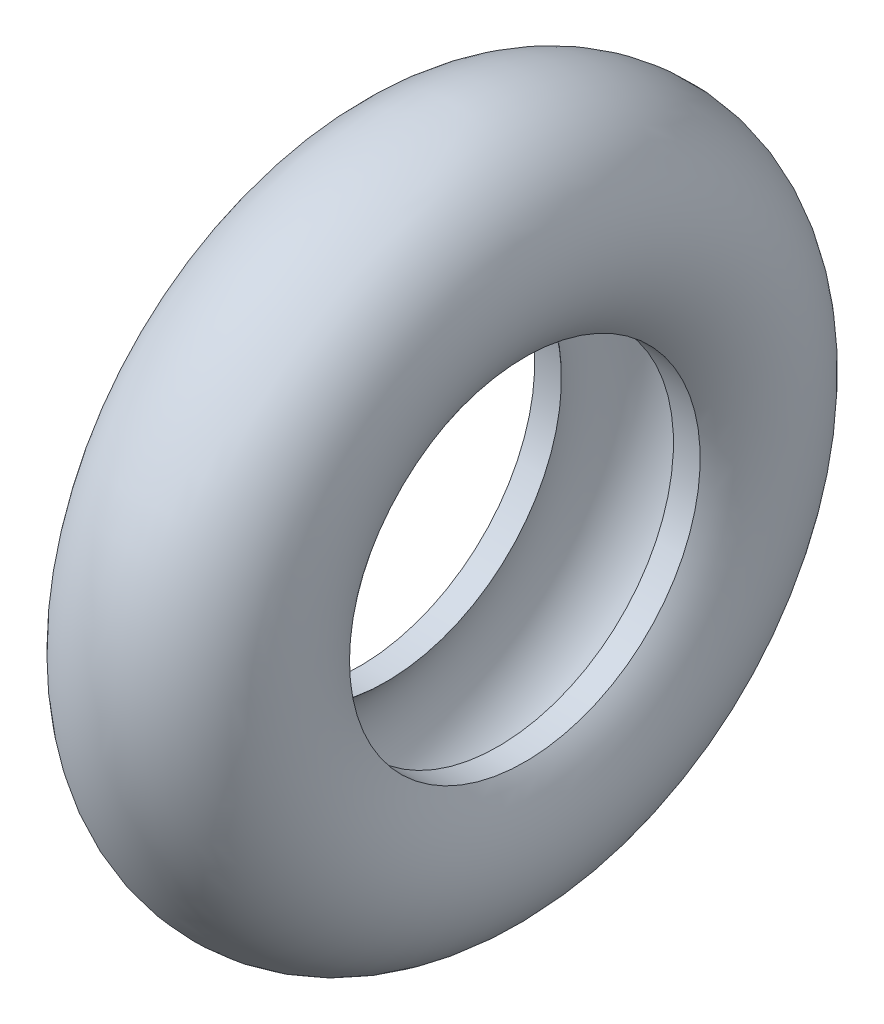
ISO-10303-21;
HEADER;
FILE_DESCRIPTION(('STEP AP214'),'2;1');
FILE_NAME('part.step','',(''),(''),'','','');
FILE_SCHEMA(('AUTOMOTIVE_DESIGN { 1 0 10303 214 1 1 1 1 }'));
ENDSEC;
DATA;
#1=APPLICATION_CONTEXT('core data for automotive mechanical design processes');
#2=APPLICATION_PROTOCOL_DEFINITION('international standard','automotive_design',2000,#1);
#3=PRODUCT_CONTEXT('',#1,'mechanical');
#4=PRODUCT('Part','Part','',(#3));
#5=PRODUCT_RELATED_PRODUCT_CATEGORY('part','',(#4));
#6=PRODUCT_DEFINITION_FORMATION('','',#4);
#7=PRODUCT_DEFINITION_CONTEXT('part definition',#1,'design');
#8=PRODUCT_DEFINITION('design','',#6,#7);
#9=PRODUCT_DEFINITION_SHAPE('','',#8);
#10=(LENGTH_UNIT() NAMED_UNIT(*) SI_UNIT(.MILLI.,.METRE.));
#11=(NAMED_UNIT(*) PLANE_ANGLE_UNIT() SI_UNIT($,.RADIAN.));
#12=(NAMED_UNIT(*) SI_UNIT($,.STERADIAN.) SOLID_ANGLE_UNIT());
#13=UNCERTAINTY_MEASURE_WITH_UNIT(LENGTH_MEASURE(1.E-05),#10,'distance_accuracy_value','');
#14=(GEOMETRIC_REPRESENTATION_CONTEXT(3) GLOBAL_UNCERTAINTY_ASSIGNED_CONTEXT((#13)) GLOBAL_UNIT_ASSIGNED_CONTEXT((#10,
#11,#12)) REPRESENTATION_CONTEXT('',''));
#15=CARTESIAN_POINT('',(0.,0.,0.));
#16=DIRECTION('',(0.,0.,1.));
#17=DIRECTION('',(1.,0.,0.));
#18=AXIS2_PLACEMENT_3D('',#15,#16,#17);
#19=CARTESIAN_POINT('',(0.,0.,0.));
#20=DIRECTION('',(-1.,0.,0.));
#21=DIRECTION('',(0.,0.,1.));
#22=AXIS2_PLACEMENT_3D('',#19,#20,#21);
#23=TOROIDAL_SURFACE('',#22,128.44,56.555);
#24=CARTESIAN_POINT('',(-43.6239571914589,0.,0.));
#25=DIRECTION('',(-1.,0.,0.));
#26=DIRECTION('',(0.,0.,1.));
#27=AXIS2_PLACEMENT_3D('',#24,#25,#26);
#28=CIRCLE('',#27,92.4480789070969);
#29=CARTESIAN_POINT('',(-43.6239571914589,0.,92.4480789070969));
#30=VERTEX_POINT('',#29);
#31=EDGE_CURVE('E10',#30,#30,#28,.T.);
#32=ORIENTED_EDGE('',*,*,#31,.F.);
#33=EDGE_LOOP('',(#32));
#34=FACE_BOUND('',#33,.T.);
#35=CARTESIAN_POINT('',(43.6239571914589,0.,0.));
#36=DIRECTION('',(-1.,0.,0.));
#37=DIRECTION('',(0.,0.,1.));
#38=AXIS2_PLACEMENT_3D('',#35,#36,#37);
#39=CIRCLE('',#38,92.4480789070969);
#40=CARTESIAN_POINT('',(43.6239571914589,0.,92.4480789070969));
#41=VERTEX_POINT('',#40);
#42=EDGE_CURVE('E44',#41,#41,#39,.T.);
#43=ORIENTED_EDGE('',*,*,#42,.T.);
#44=EDGE_LOOP('',(#43));
#45=FACE_BOUND('',#44,.T.);
#46=ADVANCED_FACE('F30',(#34,#45),#23,.T.);
#47=CARTESIAN_POINT('',(-106.608138564992,0.,0.));
#48=DIRECTION('',(-1.,0.,0.));
#49=DIRECTION('',(0.,0.,1.));
#50=AXIS2_PLACEMENT_3D('',#47,#48,#49);
#51=CYLINDRICAL_SURFACE('',#50,92.4480789070969);
#52=CARTESIAN_POINT('',(-29.5287934234069,0.,0.));
#53=DIRECTION('',(-1.,0.,0.));
#54=DIRECTION('',(0.,0.,1.));
#55=AXIS2_PLACEMENT_3D('',#52,#53,#54);
#56=CIRCLE('',#55,92.4480789070969);
#57=CARTESIAN_POINT('',(-29.5287934234069,0.,92.4480789070969));
#58=VERTEX_POINT('',#57);
#59=EDGE_CURVE('E36',#58,#58,#56,.T.);
#60=ORIENTED_EDGE('',*,*,#59,.F.);
#61=EDGE_LOOP('',(#60));
#62=FACE_BOUND('',#61,.T.);
#63=ORIENTED_EDGE('',*,*,#31,.T.);
#64=EDGE_LOOP('',(#63));
#65=FACE_BOUND('',#64,.T.);
#66=ADVANCED_FACE('F59',(#62,#65),#51,.F.);
#67=CARTESIAN_POINT('',(0.,0.,0.));
#68=DIRECTION('',(-1.,0.,0.));
#69=DIRECTION('',(0.,0.,1.));
#70=AXIS2_PLACEMENT_3D('',#67,#68,#69);
#71=TOROIDAL_SURFACE('',#70,128.44,46.555);
#72=CARTESIAN_POINT('',(29.5287934234069,0.,0.));
#73=DIRECTION('',(-1.,0.,0.));
#74=DIRECTION('',(0.,0.,1.));
#75=AXIS2_PLACEMENT_3D('',#72,#73,#74);
#76=CIRCLE('',#75,92.4480789070969);
#77=CARTESIAN_POINT('',(29.5287934234069,0.,92.4480789070969));
#78=VERTEX_POINT('',#77);
#79=EDGE_CURVE('E40',#78,#78,#76,.T.);
#80=ORIENTED_EDGE('',*,*,#79,.F.);
#81=EDGE_LOOP('',(#80));
#82=FACE_BOUND('',#81,.T.);
#83=ORIENTED_EDGE('',*,*,#59,.T.);
#84=EDGE_LOOP('',(#83));
#85=FACE_BOUND('',#84,.T.);
#86=ADVANCED_FACE('F54',(#82,#85),#71,.F.);
#87=CARTESIAN_POINT('',(-106.608138564992,0.,0.));
#88=DIRECTION('',(-1.,0.,0.));
#89=DIRECTION('',(0.,0.,1.));
#90=AXIS2_PLACEMENT_3D('',#87,#88,#89);
#91=CYLINDRICAL_SURFACE('',#90,92.4480789070969);
#92=ORIENTED_EDGE('',*,*,#42,.F.);
#93=EDGE_LOOP('',(#92));
#94=FACE_BOUND('',#93,.T.);
#95=ORIENTED_EDGE('',*,*,#79,.T.);
#96=EDGE_LOOP('',(#95));
#97=FACE_BOUND('',#96,.T.);
#98=ADVANCED_FACE('F51',(#94,#97),#91,.F.);
#99=CLOSED_SHELL('',(#46,#66,#86,#98));
#100=MANIFOLD_SOLID_BREP('B2',#99);
#101=ADVANCED_BREP_SHAPE_REPRESENTATION('',(#18,#100),#14);
#102=SHAPE_DEFINITION_REPRESENTATION(#9,#101);
ENDSEC;
END-ISO-10303-21;
